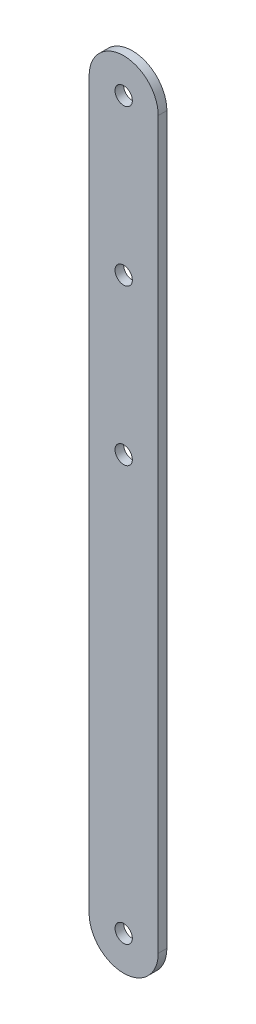
ISO-10303-21;
HEADER;
FILE_DESCRIPTION(('STEP AP214'),'2;1');
FILE_NAME('part.step','',(''),(''),'','','');
FILE_SCHEMA(('AUTOMOTIVE_DESIGN { 1 0 10303 214 1 1 1 1 }'));
ENDSEC;
DATA;
#1=APPLICATION_CONTEXT('core data for automotive mechanical design processes');
#2=APPLICATION_PROTOCOL_DEFINITION('international standard','automotive_design',2000,#1);
#3=PRODUCT_CONTEXT('',#1,'mechanical');
#4=PRODUCT('Part','Part','',(#3));
#5=PRODUCT_RELATED_PRODUCT_CATEGORY('part','',(#4));
#6=PRODUCT_DEFINITION_FORMATION('','',#4);
#7=PRODUCT_DEFINITION_CONTEXT('part definition',#1,'design');
#8=PRODUCT_DEFINITION('design','',#6,#7);
#9=PRODUCT_DEFINITION_SHAPE('','',#8);
#10=(LENGTH_UNIT() NAMED_UNIT(*) SI_UNIT(.MILLI.,.METRE.));
#11=(NAMED_UNIT(*) PLANE_ANGLE_UNIT() SI_UNIT($,.RADIAN.));
#12=(NAMED_UNIT(*) SI_UNIT($,.STERADIAN.) SOLID_ANGLE_UNIT());
#13=UNCERTAINTY_MEASURE_WITH_UNIT(LENGTH_MEASURE(1.E-05),#10,'distance_accuracy_value','');
#14=(GEOMETRIC_REPRESENTATION_CONTEXT(3) GLOBAL_UNCERTAINTY_ASSIGNED_CONTEXT((#13)) GLOBAL_UNIT_ASSIGNED_CONTEXT((#10,
#11,#12)) REPRESENTATION_CONTEXT('',''));
#15=CARTESIAN_POINT('',(0.,0.,0.));
#16=DIRECTION('',(0.,0.,1.));
#17=DIRECTION('',(1.,0.,0.));
#18=AXIS2_PLACEMENT_3D('',#15,#16,#17);
#19=CARTESIAN_POINT('',(0.,-1066.8,12.7));
#20=DIRECTION('',(0.,0.,1.));
#21=DIRECTION('',(1.,0.,0.));
#22=AXIS2_PLACEMENT_3D('',#19,#20,#21);
#23=PLANE('',#22);
#24=CARTESIAN_POINT('',(0.,-228.6,12.7));
#25=DIRECTION('',(0.,0.,1.));
#26=DIRECTION('',(1.,0.,0.));
#27=AXIS2_PLACEMENT_3D('',#24,#25,#26);
#28=CIRCLE('',#27,12.7);
#29=CARTESIAN_POINT('',(12.7,-228.6,12.7));
#30=VERTEX_POINT('',#29);
#31=EDGE_CURVE('E126',#30,#30,#28,.T.);
#32=ORIENTED_EDGE('',*,*,#31,.F.);
#33=EDGE_LOOP('',(#32));
#34=FACE_BOUND('',#33,.T.);
#35=CARTESIAN_POINT('',(0.,0.,12.7));
#36=DIRECTION('',(0.,0.,1.));
#37=DIRECTION('',(1.,0.,0.));
#38=AXIS2_PLACEMENT_3D('',#35,#36,#37);
#39=CIRCLE('',#38,12.7);
#40=CARTESIAN_POINT('',(12.7,0.,12.7));
#41=VERTEX_POINT('',#40);
#42=EDGE_CURVE('E105',#41,#41,#39,.T.);
#43=ORIENTED_EDGE('',*,*,#42,.F.);
#44=EDGE_LOOP('',(#43));
#45=FACE_BOUND('',#44,.T.);
#46=CARTESIAN_POINT('',(0.,-1066.8,12.7));
#47=DIRECTION('',(0.,0.,1.));
#48=DIRECTION('',(1.,0.,0.));
#49=AXIS2_PLACEMENT_3D('',#46,#47,#48);
#50=CIRCLE('',#49,50.7999999999999);
#51=CARTESIAN_POINT('',(-50.7999999999999,-1066.8,12.7));
#52=VERTEX_POINT('',#51);
#53=CARTESIAN_POINT('',(50.7999999999999,-1066.8,12.7));
#54=VERTEX_POINT('',#53);
#55=EDGE_CURVE('E90',#52,#54,#50,.T.);
#56=ORIENTED_EDGE('',*,*,#55,.T.);
#57=DIRECTION('',(0.,1.,0.));
#58=VECTOR('',#57,1.);
#59=CARTESIAN_POINT('',(50.7999999999999,0.,12.7));
#60=LINE('',#59,#58);
#61=CARTESIAN_POINT('',(50.7999999999999,0.,12.7));
#62=VERTEX_POINT('',#61);
#63=EDGE_CURVE('E85',#54,#62,#60,.T.);
#64=ORIENTED_EDGE('',*,*,#63,.T.);
#65=CARTESIAN_POINT('',(0.,0.,12.7));
#66=DIRECTION('',(0.,0.,1.));
#67=DIRECTION('',(1.,0.,0.));
#68=AXIS2_PLACEMENT_3D('',#65,#66,#67);
#69=CIRCLE('',#68,50.7999999999999);
#70=CARTESIAN_POINT('',(-50.7999999999999,0.,12.7));
#71=VERTEX_POINT('',#70);
#72=EDGE_CURVE('E88',#62,#71,#69,.T.);
#73=ORIENTED_EDGE('',*,*,#72,.T.);
#74=DIRECTION('',(0.,-1.,0.));
#75=VECTOR('',#74,1.);
#76=CARTESIAN_POINT('',(-50.7999999999999,-1066.8,12.7));
#77=LINE('',#76,#75);
#78=EDGE_CURVE('E55',#71,#52,#77,.T.);
#79=ORIENTED_EDGE('',*,*,#78,.T.);
#80=EDGE_LOOP('',(#56,#64,#73,#79));
#81=FACE_BOUND('',#80,.T.);
#82=CARTESIAN_POINT('',(0.,-1066.8,12.7));
#83=DIRECTION('',(0.,0.,1.));
#84=DIRECTION('',(1.,0.,0.));
#85=AXIS2_PLACEMENT_3D('',#82,#83,#84);
#86=CIRCLE('',#85,12.7);
#87=CARTESIAN_POINT('',(12.7,-1066.8,12.7));
#88=VERTEX_POINT('',#87);
#89=EDGE_CURVE('E120',#88,#88,#86,.T.);
#90=ORIENTED_EDGE('',*,*,#89,.F.);
#91=EDGE_LOOP('',(#90));
#92=FACE_BOUND('',#91,.T.);
#93=CARTESIAN_POINT('',(0.,-457.2,12.7));
#94=DIRECTION('',(0.,0.,1.));
#95=DIRECTION('',(1.,0.,0.));
#96=AXIS2_PLACEMENT_3D('',#93,#94,#95);
#97=CIRCLE('',#96,12.7);
#98=CARTESIAN_POINT('',(12.7000000000001,-457.2,12.7));
#99=VERTEX_POINT('',#98);
#100=EDGE_CURVE('E132',#99,#99,#97,.T.);
#101=ORIENTED_EDGE('',*,*,#100,.F.);
#102=EDGE_LOOP('',(#101));
#103=FACE_BOUND('',#102,.T.);
#104=ADVANCED_FACE('F38',(#34,#45,#81,#92,#103),#23,.T.);
#105=CARTESIAN_POINT('',(0.,-1066.8,0.));
#106=DIRECTION('',(0.,0.,1.));
#107=DIRECTION('',(1.,0.,0.));
#108=AXIS2_PLACEMENT_3D('',#105,#106,#107);
#109=PLANE('',#108);
#110=CARTESIAN_POINT('',(0.,-1066.8,0.));
#111=DIRECTION('',(0.,0.,1.));
#112=DIRECTION('',(1.,0.,0.));
#113=AXIS2_PLACEMENT_3D('',#110,#111,#112);
#114=CIRCLE('',#113,50.7999999999999);
#115=CARTESIAN_POINT('',(-50.7999999999999,-1066.8,0.));
#116=VERTEX_POINT('',#115);
#117=CARTESIAN_POINT('',(50.7999999999999,-1066.8,0.));
#118=VERTEX_POINT('',#117);
#119=EDGE_CURVE('E102',#116,#118,#114,.T.);
#120=ORIENTED_EDGE('',*,*,#119,.F.);
#121=DIRECTION('',(0.,-1.,0.));
#122=VECTOR('',#121,1.);
#123=CARTESIAN_POINT('',(-50.7999999999999,-1066.8,0.));
#124=LINE('',#123,#122);
#125=CARTESIAN_POINT('',(-50.7999999999999,0.,0.));
#126=VERTEX_POINT('',#125);
#127=EDGE_CURVE('E78',#126,#116,#124,.T.);
#128=ORIENTED_EDGE('',*,*,#127,.F.);
#129=CARTESIAN_POINT('',(0.,0.,0.));
#130=DIRECTION('',(0.,0.,1.));
#131=DIRECTION('',(1.,0.,0.));
#132=AXIS2_PLACEMENT_3D('',#129,#130,#131);
#133=CIRCLE('',#132,50.7999999999999);
#134=CARTESIAN_POINT('',(50.7999999999999,0.,0.));
#135=VERTEX_POINT('',#134);
#136=EDGE_CURVE('E72',#135,#126,#133,.T.);
#137=ORIENTED_EDGE('',*,*,#136,.F.);
#138=DIRECTION('',(0.,1.,0.));
#139=VECTOR('',#138,1.);
#140=CARTESIAN_POINT('',(50.7999999999999,0.,0.));
#141=LINE('',#140,#139);
#142=EDGE_CURVE('E94',#118,#135,#141,.T.);
#143=ORIENTED_EDGE('',*,*,#142,.F.);
#144=EDGE_LOOP('',(#120,#128,#137,#143));
#145=FACE_BOUND('',#144,.T.);
#146=CARTESIAN_POINT('',(0.,0.,0.));
#147=DIRECTION('',(0.,0.,1.));
#148=DIRECTION('',(1.,0.,0.));
#149=AXIS2_PLACEMENT_3D('',#146,#147,#148);
#150=CIRCLE('',#149,12.7);
#151=CARTESIAN_POINT('',(12.7,0.,0.));
#152=VERTEX_POINT('',#151);
#153=EDGE_CURVE('E117',#152,#152,#150,.T.);
#154=ORIENTED_EDGE('',*,*,#153,.T.);
#155=EDGE_LOOP('',(#154));
#156=FACE_BOUND('',#155,.T.);
#157=CARTESIAN_POINT('',(0.,-1066.8,0.));
#158=DIRECTION('',(0.,0.,1.));
#159=DIRECTION('',(1.,0.,0.));
#160=AXIS2_PLACEMENT_3D('',#157,#158,#159);
#161=CIRCLE('',#160,12.7);
#162=CARTESIAN_POINT('',(12.7,-1066.8,0.));
#163=VERTEX_POINT('',#162);
#164=EDGE_CURVE('E123',#163,#163,#161,.T.);
#165=ORIENTED_EDGE('',*,*,#164,.T.);
#166=EDGE_LOOP('',(#165));
#167=FACE_BOUND('',#166,.T.);
#168=CARTESIAN_POINT('',(0.,-228.6,0.));
#169=DIRECTION('',(0.,0.,1.));
#170=DIRECTION('',(1.,0.,0.));
#171=AXIS2_PLACEMENT_3D('',#168,#169,#170);
#172=CIRCLE('',#171,12.7);
#173=CARTESIAN_POINT('',(12.7,-228.6,0.));
#174=VERTEX_POINT('',#173);
#175=EDGE_CURVE('E129',#174,#174,#172,.T.);
#176=ORIENTED_EDGE('',*,*,#175,.T.);
#177=EDGE_LOOP('',(#176));
#178=FACE_BOUND('',#177,.T.);
#179=CARTESIAN_POINT('',(0.,-457.2,0.));
#180=DIRECTION('',(0.,0.,1.));
#181=DIRECTION('',(1.,0.,0.));
#182=AXIS2_PLACEMENT_3D('',#179,#180,#181);
#183=CIRCLE('',#182,12.7);
#184=CARTESIAN_POINT('',(12.7000000000001,-457.2,0.));
#185=VERTEX_POINT('',#184);
#186=EDGE_CURVE('E135',#185,#185,#183,.T.);
#187=ORIENTED_EDGE('',*,*,#186,.T.);
#188=EDGE_LOOP('',(#187));
#189=FACE_BOUND('',#188,.T.);
#190=ADVANCED_FACE('F113',(#145,#156,#167,#178,#189),#109,.F.);
#191=CARTESIAN_POINT('',(0.,-1066.8,12.7));
#192=DIRECTION('',(0.,0.,-1.));
#193=DIRECTION('',(-1.,0.,0.));
#194=AXIS2_PLACEMENT_3D('',#191,#192,#193);
#195=CYLINDRICAL_SURFACE('',#194,50.7999999999999);
#196=ORIENTED_EDGE('',*,*,#119,.T.);
#197=DIRECTION('',(0.,0.,-1.));
#198=VECTOR('',#197,1.);
#199=CARTESIAN_POINT('',(50.7999999999999,-1066.8,12.7));
#200=LINE('',#199,#198);
#201=EDGE_CURVE('E11',#54,#118,#200,.T.);
#202=ORIENTED_EDGE('',*,*,#201,.F.);
#203=ORIENTED_EDGE('',*,*,#55,.F.);
#204=DIRECTION('',(0.,0.,-1.));
#205=VECTOR('',#204,1.);
#206=CARTESIAN_POINT('',(-50.7999999999999,-1066.8,12.7));
#207=LINE('',#206,#205);
#208=EDGE_CURVE('E98',#52,#116,#207,.T.);
#209=ORIENTED_EDGE('',*,*,#208,.T.);
#210=EDGE_LOOP('',(#196,#202,#203,#209));
#211=FACE_BOUND('',#210,.T.);
#212=ADVANCED_FACE('F40',(#211),#195,.T.);
#213=CARTESIAN_POINT('',(50.7999999999999,0.,12.7));
#214=DIRECTION('',(-1.,0.,0.));
#215=DIRECTION('',(0.,0.,1.));
#216=AXIS2_PLACEMENT_3D('',#213,#214,#215);
#217=PLANE('',#216);
#218=ORIENTED_EDGE('',*,*,#142,.T.);
#219=DIRECTION('',(0.,0.,-1.));
#220=VECTOR('',#219,1.);
#221=CARTESIAN_POINT('',(50.7999999999999,0.,12.7));
#222=LINE('',#221,#220);
#223=EDGE_CURVE('E47',#62,#135,#222,.T.);
#224=ORIENTED_EDGE('',*,*,#223,.F.);
#225=ORIENTED_EDGE('',*,*,#63,.F.);
#226=ORIENTED_EDGE('',*,*,#201,.T.);
#227=EDGE_LOOP('',(#218,#224,#225,#226));
#228=FACE_BOUND('',#227,.T.);
#229=ADVANCED_FACE('F93',(#228),#217,.F.);
#230=CARTESIAN_POINT('',(0.,0.,12.7));
#231=DIRECTION('',(0.,0.,-1.));
#232=DIRECTION('',(-1.,0.,0.));
#233=AXIS2_PLACEMENT_3D('',#230,#231,#232);
#234=CYLINDRICAL_SURFACE('',#233,50.7999999999999);
#235=ORIENTED_EDGE('',*,*,#136,.T.);
#236=DIRECTION('',(0.,0.,-1.));
#237=VECTOR('',#236,1.);
#238=CARTESIAN_POINT('',(-50.7999999999999,0.,12.7));
#239=LINE('',#238,#237);
#240=EDGE_CURVE('E95',#71,#126,#239,.T.);
#241=ORIENTED_EDGE('',*,*,#240,.F.);
#242=ORIENTED_EDGE('',*,*,#72,.F.);
#243=ORIENTED_EDGE('',*,*,#223,.T.);
#244=EDGE_LOOP('',(#235,#241,#242,#243));
#245=FACE_BOUND('',#244,.T.);
#246=ADVANCED_FACE('F96',(#245),#234,.T.);
#247=CARTESIAN_POINT('',(-50.7999999999999,-1066.8,12.7));
#248=DIRECTION('',(1.,0.,0.));
#249=DIRECTION('',(0.,0.,-1.));
#250=AXIS2_PLACEMENT_3D('',#247,#248,#249);
#251=PLANE('',#250);
#252=ORIENTED_EDGE('',*,*,#127,.T.);
#253=ORIENTED_EDGE('',*,*,#208,.F.);
#254=ORIENTED_EDGE('',*,*,#78,.F.);
#255=ORIENTED_EDGE('',*,*,#240,.T.);
#256=EDGE_LOOP('',(#252,#253,#254,#255));
#257=FACE_BOUND('',#256,.T.);
#258=ADVANCED_FACE('F110',(#257),#251,.F.);
#259=CARTESIAN_POINT('',(0.,0.,12.7));
#260=DIRECTION('',(0.,0.,-1.));
#261=DIRECTION('',(-1.,0.,0.));
#262=AXIS2_PLACEMENT_3D('',#259,#260,#261);
#263=CYLINDRICAL_SURFACE('',#262,12.7);
#264=ORIENTED_EDGE('',*,*,#42,.T.);
#265=EDGE_LOOP('',(#264));
#266=FACE_BOUND('',#265,.T.);
#267=ORIENTED_EDGE('',*,*,#153,.F.);
#268=EDGE_LOOP('',(#267));
#269=FACE_BOUND('',#268,.T.);
#270=ADVANCED_FACE('F154',(#266,#269),#263,.F.);
#271=CARTESIAN_POINT('',(0.,-1066.8,12.7));
#272=DIRECTION('',(0.,0.,-1.));
#273=DIRECTION('',(-1.,0.,0.));
#274=AXIS2_PLACEMENT_3D('',#271,#272,#273);
#275=CYLINDRICAL_SURFACE('',#274,12.7);
#276=ORIENTED_EDGE('',*,*,#89,.T.);
#277=EDGE_LOOP('',(#276));
#278=FACE_BOUND('',#277,.T.);
#279=ORIENTED_EDGE('',*,*,#164,.F.);
#280=EDGE_LOOP('',(#279));
#281=FACE_BOUND('',#280,.T.);
#282=ADVANCED_FACE('F200',(#278,#281),#275,.F.);
#283=CARTESIAN_POINT('',(0.,-228.6,12.7));
#284=DIRECTION('',(0.,0.,-1.));
#285=DIRECTION('',(-1.,0.,0.));
#286=AXIS2_PLACEMENT_3D('',#283,#284,#285);
#287=CYLINDRICAL_SURFACE('',#286,12.7);
#288=ORIENTED_EDGE('',*,*,#31,.T.);
#289=EDGE_LOOP('',(#288));
#290=FACE_BOUND('',#289,.T.);
#291=ORIENTED_EDGE('',*,*,#175,.F.);
#292=EDGE_LOOP('',(#291));
#293=FACE_BOUND('',#292,.T.);
#294=ADVANCED_FACE('F208',(#290,#293),#287,.F.);
#295=CARTESIAN_POINT('',(0.,-457.2,12.7));
#296=DIRECTION('',(0.,0.,-1.));
#297=DIRECTION('',(-1.,0.,0.));
#298=AXIS2_PLACEMENT_3D('',#295,#296,#297);
#299=CYLINDRICAL_SURFACE('',#298,12.7);
#300=ORIENTED_EDGE('',*,*,#100,.T.);
#301=EDGE_LOOP('',(#300));
#302=FACE_BOUND('',#301,.T.);
#303=ORIENTED_EDGE('',*,*,#186,.F.);
#304=EDGE_LOOP('',(#303));
#305=FACE_BOUND('',#304,.T.);
#306=ADVANCED_FACE('F141',(#302,#305),#299,.F.);
#307=CLOSED_SHELL('',(#104,#190,#212,#229,#246,#258,#270,#282,#294,#306));
#308=MANIFOLD_SOLID_BREP('B2',#307);
#309=ADVANCED_BREP_SHAPE_REPRESENTATION('',(#18,#308),#14);
#310=SHAPE_DEFINITION_REPRESENTATION(#9,#309);
ENDSEC;
END-ISO-10303-21;
